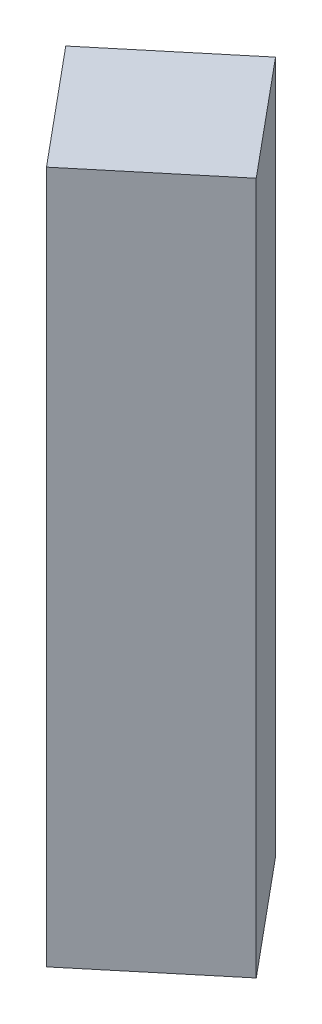
ISO-10303-21;
HEADER;
FILE_DESCRIPTION(('STEP AP214'),'2;1');
FILE_NAME('part.step','',(''),(''),'','','');
FILE_SCHEMA(('AUTOMOTIVE_DESIGN { 1 0 10303 214 1 1 1 1 }'));
ENDSEC;
DATA;
#1=APPLICATION_CONTEXT('core data for automotive mechanical design processes');
#2=APPLICATION_PROTOCOL_DEFINITION('international standard','automotive_design',2000,#1);
#3=PRODUCT_CONTEXT('',#1,'mechanical');
#4=PRODUCT('Part','Part','',(#3));
#5=PRODUCT_RELATED_PRODUCT_CATEGORY('part','',(#4));
#6=PRODUCT_DEFINITION_FORMATION('','',#4);
#7=PRODUCT_DEFINITION_CONTEXT('part definition',#1,'design');
#8=PRODUCT_DEFINITION('design','',#6,#7);
#9=PRODUCT_DEFINITION_SHAPE('','',#8);
#10=(LENGTH_UNIT() NAMED_UNIT(*) SI_UNIT(.MILLI.,.METRE.));
#11=(NAMED_UNIT(*) PLANE_ANGLE_UNIT() SI_UNIT($,.RADIAN.));
#12=(NAMED_UNIT(*) SI_UNIT($,.STERADIAN.) SOLID_ANGLE_UNIT());
#13=UNCERTAINTY_MEASURE_WITH_UNIT(LENGTH_MEASURE(1.E-05),#10,'distance_accuracy_value','');
#14=(GEOMETRIC_REPRESENTATION_CONTEXT(3) GLOBAL_UNCERTAINTY_ASSIGNED_CONTEXT((#13)) GLOBAL_UNIT_ASSIGNED_CONTEXT((#10,
#11,#12)) REPRESENTATION_CONTEXT('',''));
#15=CARTESIAN_POINT('',(0.,0.,0.));
#16=DIRECTION('',(0.,0.,1.));
#17=DIRECTION('',(1.,0.,0.));
#18=AXIS2_PLACEMENT_3D('',#15,#16,#17);
#19=CARTESIAN_POINT('',(70.4140417027024,465.,6.47014150464382));
#20=DIRECTION('',(-0.76884183207346,0.,0.639439001980584));
#21=DIRECTION('',(0.639439001980584,0.,0.76884183207346));
#22=AXIS2_PLACEMENT_3D('',#19,#20,#21);
#23=PLANE('',#22);
#24=DIRECTION('',(-0.639439001980584,0.,-0.76884183207346));
#25=VECTOR('',#24,1.);
#26=CARTESIAN_POINT('',(70.4140417027024,0.,6.47014150464382));
#27=LINE('',#26,#25);
#28=CARTESIAN_POINT('',(70.4140417027024,0.,6.47014150464382));
#29=VERTEX_POINT('',#28);
#30=CARTESIAN_POINT('',(6.47014150464381,0.,-70.4140417027024));
#31=VERTEX_POINT('',#30);
#32=EDGE_CURVE('E96',#29,#31,#27,.T.);
#33=ORIENTED_EDGE('',*,*,#32,.T.);
#34=DIRECTION('',(0.,-1.,0.));
#35=VECTOR('',#34,1.);
#36=CARTESIAN_POINT('',(6.47014150464381,465.,-70.4140417027024));
#37=LINE('',#36,#35);
#38=CARTESIAN_POINT('',(6.47014150464381,465.,-70.4140417027024));
#39=VERTEX_POINT('',#38);
#40=EDGE_CURVE('E11',#39,#31,#37,.T.);
#41=ORIENTED_EDGE('',*,*,#40,.F.);
#42=DIRECTION('',(-0.639439001980584,0.,-0.76884183207346));
#43=VECTOR('',#42,1.);
#44=CARTESIAN_POINT('',(70.4140417027024,465.,6.47014150464382));
#45=LINE('',#44,#43);
#46=CARTESIAN_POINT('',(70.4140417027024,465.,6.47014150464382));
#47=VERTEX_POINT('',#46);
#48=EDGE_CURVE('E84',#47,#39,#45,.T.);
#49=ORIENTED_EDGE('',*,*,#48,.F.);
#50=DIRECTION('',(0.,-1.,0.));
#51=VECTOR('',#50,1.);
#52=CARTESIAN_POINT('',(70.4140417027024,465.,6.47014150464382));
#53=LINE('',#52,#51);
#54=EDGE_CURVE('E92',#47,#29,#53,.T.);
#55=ORIENTED_EDGE('',*,*,#54,.T.);
#56=EDGE_LOOP('',(#33,#41,#49,#55));
#57=FACE_BOUND('',#56,.T.);
#58=ADVANCED_FACE('F33',(#57),#23,.F.);
#59=CARTESIAN_POINT('',(-70.4140417027024,465.,-6.47014150464383));
#60=DIRECTION('',(0.639439001980584,0.,0.76884183207346));
#61=DIRECTION('',(0.76884183207346,0.,-0.639439001980584));
#62=AXIS2_PLACEMENT_3D('',#59,#60,#61);
#63=PLANE('',#62);
#64=DIRECTION('',(-0.76884183207346,0.,0.639439001980584));
#65=VECTOR('',#64,1.);
#66=CARTESIAN_POINT('',(-70.4140417027024,0.,-6.47014150464383));
#67=LINE('',#66,#65);
#68=CARTESIAN_POINT('',(-70.4140417027024,0.,-6.47014150464383));
#69=VERTEX_POINT('',#68);
#70=EDGE_CURVE('E88',#31,#69,#67,.T.);
#71=ORIENTED_EDGE('',*,*,#70,.T.);
#72=DIRECTION('',(0.,-1.,0.));
#73=VECTOR('',#72,1.);
#74=CARTESIAN_POINT('',(-70.4140417027024,465.,-6.47014150464383));
#75=LINE('',#74,#73);
#76=CARTESIAN_POINT('',(-70.4140417027024,465.,-6.47014150464383));
#77=VERTEX_POINT('',#76);
#78=EDGE_CURVE('E41',#77,#69,#75,.T.);
#79=ORIENTED_EDGE('',*,*,#78,.F.);
#80=DIRECTION('',(-0.76884183207346,0.,0.639439001980584));
#81=VECTOR('',#80,1.);
#82=CARTESIAN_POINT('',(-70.4140417027024,465.,-6.47014150464383));
#83=LINE('',#82,#81);
#84=EDGE_CURVE('E79',#39,#77,#83,.T.);
#85=ORIENTED_EDGE('',*,*,#84,.F.);
#86=ORIENTED_EDGE('',*,*,#40,.T.);
#87=EDGE_LOOP('',(#71,#79,#85,#86));
#88=FACE_BOUND('',#87,.T.);
#89=ADVANCED_FACE('F87',(#88),#63,.F.);
#90=CARTESIAN_POINT('',(-6.4701415046438,465.,70.4140417027024));
#91=DIRECTION('',(0.76884183207346,0.,-0.639439001980584));
#92=DIRECTION('',(-0.639439001980584,0.,-0.76884183207346));
#93=AXIS2_PLACEMENT_3D('',#90,#91,#92);
#94=PLANE('',#93);
#95=DIRECTION('',(0.639439001980584,0.,0.76884183207346));
#96=VECTOR('',#95,1.);
#97=CARTESIAN_POINT('',(-6.4701415046438,0.,70.4140417027024));
#98=LINE('',#97,#96);
#99=CARTESIAN_POINT('',(-6.4701415046438,0.,70.4140417027024));
#100=VERTEX_POINT('',#99);
#101=EDGE_CURVE('E66',#69,#100,#98,.T.);
#102=ORIENTED_EDGE('',*,*,#101,.T.);
#103=DIRECTION('',(0.,-1.,0.));
#104=VECTOR('',#103,1.);
#105=CARTESIAN_POINT('',(-6.4701415046438,465.,70.4140417027024));
#106=LINE('',#105,#104);
#107=CARTESIAN_POINT('',(-6.4701415046438,465.,70.4140417027024));
#108=VERTEX_POINT('',#107);
#109=EDGE_CURVE('E89',#108,#100,#106,.T.);
#110=ORIENTED_EDGE('',*,*,#109,.F.);
#111=DIRECTION('',(0.639439001980584,0.,0.76884183207346));
#112=VECTOR('',#111,1.);
#113=CARTESIAN_POINT('',(-6.4701415046438,465.,70.4140417027024));
#114=LINE('',#113,#112);
#115=EDGE_CURVE('E82',#77,#108,#114,.T.);
#116=ORIENTED_EDGE('',*,*,#115,.F.);
#117=ORIENTED_EDGE('',*,*,#78,.T.);
#118=EDGE_LOOP('',(#102,#110,#116,#117));
#119=FACE_BOUND('',#118,.T.);
#120=ADVANCED_FACE('F90',(#119),#94,.F.);
#121=CARTESIAN_POINT('',(-6.4701415046438,465.,70.4140417027024));
#122=DIRECTION('',(-0.639439001980584,0.,-0.76884183207346));
#123=DIRECTION('',(-0.76884183207346,0.,0.639439001980584));
#124=AXIS2_PLACEMENT_3D('',#121,#122,#123);
#125=PLANE('',#124);
#126=DIRECTION('',(0.76884183207346,0.,-0.639439001980584));
#127=VECTOR('',#126,1.);
#128=CARTESIAN_POINT('',(-6.4701415046438,0.,70.4140417027024));
#129=LINE('',#128,#127);
#130=EDGE_CURVE('E72',#100,#29,#129,.T.);
#131=ORIENTED_EDGE('',*,*,#130,.T.);
#132=ORIENTED_EDGE('',*,*,#54,.F.);
#133=DIRECTION('',(0.76884183207346,0.,-0.639439001980584));
#134=VECTOR('',#133,1.);
#135=CARTESIAN_POINT('',(-6.4701415046438,465.,70.4140417027024));
#136=LINE('',#135,#134);
#137=EDGE_CURVE('E49',#108,#47,#136,.T.);
#138=ORIENTED_EDGE('',*,*,#137,.F.);
#139=ORIENTED_EDGE('',*,*,#109,.T.);
#140=EDGE_LOOP('',(#131,#132,#138,#139));
#141=FACE_BOUND('',#140,.T.);
#142=ADVANCED_FACE('F103',(#141),#125,.F.);
#143=CARTESIAN_POINT('',(0.,465.,0.));
#144=DIRECTION('',(0.,-1.,0.));
#145=DIRECTION('',(0.,0.,-1.));
#146=AXIS2_PLACEMENT_3D('',#143,#144,#145);
#147=PLANE('',#146);
#148=ORIENTED_EDGE('',*,*,#48,.T.);
#149=ORIENTED_EDGE('',*,*,#84,.T.);
#150=ORIENTED_EDGE('',*,*,#115,.T.);
#151=ORIENTED_EDGE('',*,*,#137,.T.);
#152=EDGE_LOOP('',(#148,#149,#150,#151));
#153=FACE_BOUND('',#152,.T.);
#154=ADVANCED_FACE('F80',(#153),#147,.F.);
#155=CARTESIAN_POINT('',(0.,0.,0.));
#156=DIRECTION('',(0.,-1.,0.));
#157=DIRECTION('',(0.,0.,-1.));
#158=AXIS2_PLACEMENT_3D('',#155,#156,#157);
#159=PLANE('',#158);
#160=ORIENTED_EDGE('',*,*,#32,.F.);
#161=ORIENTED_EDGE('',*,*,#130,.F.);
#162=ORIENTED_EDGE('',*,*,#101,.F.);
#163=ORIENTED_EDGE('',*,*,#70,.F.);
#164=EDGE_LOOP('',(#160,#161,#162,#163));
#165=FACE_BOUND('',#164,.T.);
#166=ADVANCED_FACE('F106',(#165),#159,.T.);
#167=CLOSED_SHELL('',(#58,#89,#120,#142,#154,#166));
#168=MANIFOLD_SOLID_BREP('B2',#167);
#169=ADVANCED_BREP_SHAPE_REPRESENTATION('',(#18,#168),#14);
#170=SHAPE_DEFINITION_REPRESENTATION(#9,#169);
ENDSEC;
END-ISO-10303-21;
